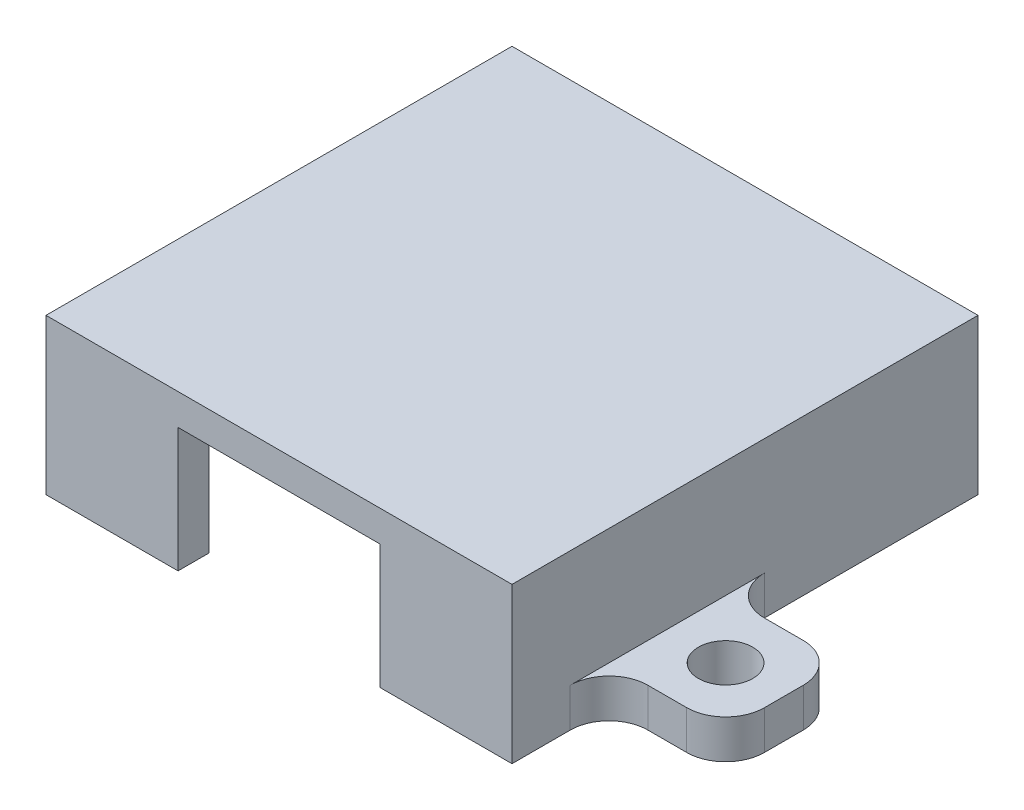
ISO-10303-21;
HEADER;
FILE_DESCRIPTION(('STEP AP214'),'2;1');
FILE_NAME('part.step','',(''),(''),'','','');
FILE_SCHEMA(('AUTOMOTIVE_DESIGN { 1 0 10303 214 1 1 1 1 }'));
ENDSEC;
DATA;
#1=APPLICATION_CONTEXT('core data for automotive mechanical design processes');
#2=APPLICATION_PROTOCOL_DEFINITION('international standard','automotive_design',2000,#1);
#3=PRODUCT_CONTEXT('',#1,'mechanical');
#4=PRODUCT('Part','Part','',(#3));
#5=PRODUCT_RELATED_PRODUCT_CATEGORY('part','',(#4));
#6=PRODUCT_DEFINITION_FORMATION('','',#4);
#7=PRODUCT_DEFINITION_CONTEXT('part definition',#1,'design');
#8=PRODUCT_DEFINITION('design','',#6,#7);
#9=PRODUCT_DEFINITION_SHAPE('','',#8);
#10=(LENGTH_UNIT() NAMED_UNIT(*) SI_UNIT(.MILLI.,.METRE.));
#11=(NAMED_UNIT(*) PLANE_ANGLE_UNIT() SI_UNIT($,.RADIAN.));
#12=(NAMED_UNIT(*) SI_UNIT($,.STERADIAN.) SOLID_ANGLE_UNIT());
#13=UNCERTAINTY_MEASURE_WITH_UNIT(LENGTH_MEASURE(1.E-05),#10,'distance_accuracy_value','');
#14=(GEOMETRIC_REPRESENTATION_CONTEXT(3) GLOBAL_UNCERTAINTY_ASSIGNED_CONTEXT((#13)) GLOBAL_UNIT_ASSIGNED_CONTEXT((#10,
#11,#12)) REPRESENTATION_CONTEXT('',''));
#15=CARTESIAN_POINT('',(0.,0.,0.));
#16=DIRECTION('',(0.,0.,1.));
#17=DIRECTION('',(1.,0.,0.));
#18=AXIS2_PLACEMENT_3D('',#15,#16,#17);
#19=CARTESIAN_POINT('',(0.,10.,0.));
#20=DIRECTION('',(1.,0.,0.));
#21=DIRECTION('',(0.,0.,-1.));
#22=AXIS2_PLACEMENT_3D('',#19,#20,#21);
#23=PLANE('',#22);
#24=DIRECTION('',(0.,0.,-1.));
#25=VECTOR('',#24,1.);
#26=CARTESIAN_POINT('',(0.,2.5,-6.25));
#27=LINE('',#26,#25);
#28=CARTESIAN_POINT('',(0.,2.5,-3.75));
#29=VERTEX_POINT('',#28);
#30=CARTESIAN_POINT('',(0.,2.5,-16.25));
#31=VERTEX_POINT('',#30);
#32=EDGE_CURVE('E493',#29,#31,#27,.T.);
#33=ORIENTED_EDGE('',*,*,#32,.F.);
#34=DIRECTION('',(0.,1.,0.));
#35=VECTOR('',#34,1.);
#36=CARTESIAN_POINT('',(0.,0.,-3.75));
#37=LINE('',#36,#35);
#38=CARTESIAN_POINT('',(0.,0.,-3.75));
#39=VERTEX_POINT('',#38);
#40=EDGE_CURVE('E357',#29,#39,#37,.F.);
#41=ORIENTED_EDGE('',*,*,#40,.T.);
#42=DIRECTION('',(0.,0.,1.));
#43=VECTOR('',#42,1.);
#44=CARTESIAN_POINT('',(0.,0.,0.));
#45=LINE('',#44,#43);
#46=CARTESIAN_POINT('',(0.,0.,0.));
#47=VERTEX_POINT('',#46);
#48=EDGE_CURVE('E311',#39,#47,#45,.T.);
#49=ORIENTED_EDGE('',*,*,#48,.T.);
#50=DIRECTION('',(0.,-1.,0.));
#51=VECTOR('',#50,1.);
#52=CARTESIAN_POINT('',(0.,10.,0.));
#53=LINE('',#52,#51);
#54=CARTESIAN_POINT('',(0.,10.,0.));
#55=VERTEX_POINT('',#54);
#56=EDGE_CURVE('E346',#55,#47,#53,.T.);
#57=ORIENTED_EDGE('',*,*,#56,.F.);
#58=DIRECTION('',(0.,0.,1.));
#59=VECTOR('',#58,1.);
#60=CARTESIAN_POINT('',(0.,10.,0.));
#61=LINE('',#60,#59);
#62=CARTESIAN_POINT('',(0.,10.,-30.));
#63=VERTEX_POINT('',#62);
#64=EDGE_CURVE('E313',#63,#55,#61,.T.);
#65=ORIENTED_EDGE('',*,*,#64,.F.);
#66=DIRECTION('',(0.,-1.,0.));
#67=VECTOR('',#66,1.);
#68=CARTESIAN_POINT('',(0.,10.,-30.));
#69=LINE('',#68,#67);
#70=CARTESIAN_POINT('',(0.,0.,-30.));
#71=VERTEX_POINT('',#70);
#72=EDGE_CURVE('E323',#63,#71,#69,.T.);
#73=ORIENTED_EDGE('',*,*,#72,.T.);
#74=CARTESIAN_POINT('',(0.,0.,-16.25));
#75=VERTEX_POINT('',#74);
#76=EDGE_CURVE('E324',#71,#75,#45,.T.);
#77=ORIENTED_EDGE('',*,*,#76,.T.);
#78=DIRECTION('',(0.,-1.,0.));
#79=VECTOR('',#78,1.);
#80=CARTESIAN_POINT('',(0.,2.5,-16.25));
#81=LINE('',#80,#79);
#82=EDGE_CURVE('E354',#75,#31,#81,.F.);
#83=ORIENTED_EDGE('',*,*,#82,.T.);
#84=EDGE_LOOP('',(#33,#41,#49,#57,#65,#73,#77,#83));
#85=FACE_BOUND('',#84,.T.);
#86=ADVANCED_FACE('F35',(#85),#23,.F.);
#87=CARTESIAN_POINT('',(0.,0.,0.));
#88=DIRECTION('',(0.,-1.,0.));
#89=DIRECTION('',(0.,0.,-1.));
#90=AXIS2_PLACEMENT_3D('',#87,#88,#89);
#91=PLANE('',#90);
#92=CARTESIAN_POINT('',(33.75,0.,-10.));
#93=DIRECTION('',(0.,-1.,0.));
#94=DIRECTION('',(0.,0.,1.));
#95=AXIS2_PLACEMENT_3D('',#92,#93,#94);
#96=CIRCLE('',#95,1.75);
#97=CARTESIAN_POINT('',(33.75,0.,-8.25));
#98=VERTEX_POINT('',#97);
#99=EDGE_CURVE('E646',#98,#98,#96,.T.);
#100=ORIENTED_EDGE('',*,*,#99,.F.);
#101=EDGE_LOOP('',(#100));
#102=FACE_BOUND('',#101,.T.);
#103=DIRECTION('',(-1.,0.,0.));
#104=VECTOR('',#103,1.);
#105=CARTESIAN_POINT('',(37.5,0.,-13.75));
#106=LINE('',#105,#104);
#107=CARTESIAN_POINT('',(35.,0.,-13.75));
#108=VERTEX_POINT('',#107);
#109=CARTESIAN_POINT('',(32.5,0.,-13.75));
#110=VERTEX_POINT('',#109);
#111=EDGE_CURVE('E473',#108,#110,#106,.T.);
#112=ORIENTED_EDGE('',*,*,#111,.F.);
#113=CARTESIAN_POINT('',(35.,0.,-11.25));
#114=DIRECTION('',(0.,-1.,0.));
#115=DIRECTION('',(0.,0.,-1.));
#116=AXIS2_PLACEMENT_3D('',#113,#114,#115);
#117=CIRCLE('',#116,2.5);
#118=CARTESIAN_POINT('',(37.5,0.,-11.25));
#119=VERTEX_POINT('',#118);
#120=EDGE_CURVE('E394',#108,#119,#117,.T.);
#121=ORIENTED_EDGE('',*,*,#120,.T.);
#122=DIRECTION('',(0.,0.,1.));
#123=VECTOR('',#122,1.);
#124=CARTESIAN_POINT('',(37.5,0.,-6.25));
#125=LINE('',#124,#123);
#126=CARTESIAN_POINT('',(37.5,0.,-8.75));
#127=VERTEX_POINT('',#126);
#128=EDGE_CURVE('E641',#119,#127,#125,.T.);
#129=ORIENTED_EDGE('',*,*,#128,.T.);
#130=CARTESIAN_POINT('',(35.,0.,-8.75));
#131=DIRECTION('',(0.,-1.,0.));
#132=DIRECTION('',(0.,0.,-1.));
#133=AXIS2_PLACEMENT_3D('',#130,#131,#132);
#134=CIRCLE('',#133,2.5);
#135=CARTESIAN_POINT('',(35.,0.,-6.25));
#136=VERTEX_POINT('',#135);
#137=EDGE_CURVE('E392',#127,#136,#134,.T.);
#138=ORIENTED_EDGE('',*,*,#137,.T.);
#139=DIRECTION('',(-1.,0.,0.));
#140=VECTOR('',#139,1.);
#141=CARTESIAN_POINT('',(37.5,0.,-6.25));
#142=LINE('',#141,#140);
#143=CARTESIAN_POINT('',(32.5,0.,-6.25));
#144=VERTEX_POINT('',#143);
#145=EDGE_CURVE('E438',#136,#144,#142,.T.);
#146=ORIENTED_EDGE('',*,*,#145,.T.);
#147=CARTESIAN_POINT('',(32.5,0.,-3.75));
#148=DIRECTION('',(0.,-1.,0.));
#149=DIRECTION('',(0.,0.,-1.));
#150=AXIS2_PLACEMENT_3D('',#147,#148,#149);
#151=CIRCLE('',#150,2.5);
#152=CARTESIAN_POINT('',(30.,0.,-3.75));
#153=VERTEX_POINT('',#152);
#154=EDGE_CURVE('E12',#144,#153,#151,.F.);
#155=ORIENTED_EDGE('',*,*,#154,.T.);
#156=DIRECTION('',(0.,0.,-1.));
#157=VECTOR('',#156,1.);
#158=CARTESIAN_POINT('',(30.,0.,0.));
#159=LINE('',#158,#157);
#160=CARTESIAN_POINT('',(30.,0.,0.));
#161=VERTEX_POINT('',#160);
#162=EDGE_CURVE('E332',#161,#153,#159,.T.);
#163=ORIENTED_EDGE('',*,*,#162,.F.);
#164=DIRECTION('',(1.,0.,0.));
#165=VECTOR('',#164,1.);
#166=CARTESIAN_POINT('',(0.,0.,0.));
#167=LINE('',#166,#165);
#168=CARTESIAN_POINT('',(21.5,0.,0.));
#169=VERTEX_POINT('',#168);
#170=EDGE_CURVE('E327',#169,#161,#167,.T.);
#171=ORIENTED_EDGE('',*,*,#170,.F.);
#172=DIRECTION('',(0.,0.,1.));
#173=VECTOR('',#172,1.);
#174=CARTESIAN_POINT('',(21.5,0.,0.));
#175=LINE('',#174,#173);
#176=CARTESIAN_POINT('',(21.5,0.,-2.));
#177=VERTEX_POINT('',#176);
#178=EDGE_CURVE('E285',#177,#169,#175,.T.);
#179=ORIENTED_EDGE('',*,*,#178,.F.);
#180=DIRECTION('',(-1.,0.,0.));
#181=VECTOR('',#180,1.);
#182=CARTESIAN_POINT('',(21.5,0.,-2.));
#183=LINE('',#182,#181);
#184=CARTESIAN_POINT('',(28.,0.,-2.));
#185=VERTEX_POINT('',#184);
#186=EDGE_CURVE('E282',#185,#177,#183,.T.);
#187=ORIENTED_EDGE('',*,*,#186,.F.);
#188=DIRECTION('',(0.,0.,1.));
#189=VECTOR('',#188,1.);
#190=CARTESIAN_POINT('',(28.,0.,-2.));
#191=LINE('',#190,#189);
#192=CARTESIAN_POINT('',(28.,0.,-30.));
#193=VERTEX_POINT('',#192);
#194=EDGE_CURVE('E279',#193,#185,#191,.T.);
#195=ORIENTED_EDGE('',*,*,#194,.F.);
#196=DIRECTION('',(-1.,0.,0.));
#197=VECTOR('',#196,1.);
#198=CARTESIAN_POINT('',(0.,0.,-30.));
#199=LINE('',#198,#197);
#200=CARTESIAN_POINT('',(30.,0.,-30.));
#201=VERTEX_POINT('',#200);
#202=EDGE_CURVE('E317',#201,#193,#199,.T.);
#203=ORIENTED_EDGE('',*,*,#202,.F.);
#204=CARTESIAN_POINT('',(30.,0.,-16.25));
#205=VERTEX_POINT('',#204);
#206=EDGE_CURVE('E331',#205,#201,#159,.T.);
#207=ORIENTED_EDGE('',*,*,#206,.F.);
#208=CARTESIAN_POINT('',(32.5,0.,-16.25));
#209=DIRECTION('',(0.,-1.,0.));
#210=DIRECTION('',(0.,0.,-1.));
#211=AXIS2_PLACEMENT_3D('',#208,#209,#210);
#212=CIRCLE('',#211,2.5);
#213=EDGE_CURVE('E413',#205,#110,#212,.F.);
#214=ORIENTED_EDGE('',*,*,#213,.T.);
#215=EDGE_LOOP('',(#112,#121,#129,#138,#146,#155,#163,#171,#179,#187,#195,#203,#207,#214));
#216=FACE_BOUND('',#215,.T.);
#217=ADVANCED_FACE('F436',(#102,#216),#91,.T.);
#218=DIRECTION('',(0.,0.,-1.));
#219=VECTOR('',#218,1.);
#220=CARTESIAN_POINT('',(22.,0.,-28.));
#221=LINE('',#220,#219);
#222=CARTESIAN_POINT('',(22.,0.,-28.));
#223=VERTEX_POINT('',#222);
#224=CARTESIAN_POINT('',(22.,0.,-30.));
#225=VERTEX_POINT('',#224);
#226=EDGE_CURVE('E277',#223,#225,#221,.T.);
#227=ORIENTED_EDGE('',*,*,#226,.F.);
#228=DIRECTION('',(1.,0.,0.));
#229=VECTOR('',#228,1.);
#230=CARTESIAN_POINT('',(8.,0.,-28.));
#231=LINE('',#230,#229);
#232=CARTESIAN_POINT('',(8.,0.,-28.));
#233=VERTEX_POINT('',#232);
#234=EDGE_CURVE('E271',#233,#223,#231,.T.);
#235=ORIENTED_EDGE('',*,*,#234,.F.);
#236=DIRECTION('',(0.,0.,1.));
#237=VECTOR('',#236,1.);
#238=CARTESIAN_POINT('',(8.,0.,-30.));
#239=LINE('',#238,#237);
#240=CARTESIAN_POINT('',(8.,0.,-30.));
#241=VERTEX_POINT('',#240);
#242=EDGE_CURVE('E268',#241,#233,#239,.T.);
#243=ORIENTED_EDGE('',*,*,#242,.F.);
#244=EDGE_CURVE('E337',#225,#241,#199,.T.);
#245=ORIENTED_EDGE('',*,*,#244,.F.);
#246=EDGE_LOOP('',(#227,#235,#243,#245));
#247=FACE_BOUND('',#246,.T.);
#248=ADVANCED_FACE('F580',(#247),#91,.T.);
#249=CARTESIAN_POINT('',(0.,10.,0.));
#250=DIRECTION('',(0.,0.,-1.));
#251=DIRECTION('',(-1.,0.,0.));
#252=AXIS2_PLACEMENT_3D('',#249,#250,#251);
#253=PLANE('',#252);
#254=CARTESIAN_POINT('',(8.5,0.,0.));
#255=VERTEX_POINT('',#254);
#256=EDGE_CURVE('E328',#47,#255,#167,.T.);
#257=ORIENTED_EDGE('',*,*,#256,.T.);
#258=DIRECTION('',(0.,-1.,0.));
#259=VECTOR('',#258,1.);
#260=CARTESIAN_POINT('',(8.5,49.6988664825584,0.));
#261=LINE('',#260,#259);
#262=CARTESIAN_POINT('',(8.5,8.,0.));
#263=VERTEX_POINT('',#262);
#264=EDGE_CURVE('E287',#263,#255,#261,.T.);
#265=ORIENTED_EDGE('',*,*,#264,.F.);
#266=DIRECTION('',(1.,0.,0.));
#267=VECTOR('',#266,1.);
#268=CARTESIAN_POINT('',(8.5,8.,0.));
#269=LINE('',#268,#267);
#270=CARTESIAN_POINT('',(21.5,8.,0.));
#271=VERTEX_POINT('',#270);
#272=EDGE_CURVE('E531',#263,#271,#269,.T.);
#273=ORIENTED_EDGE('',*,*,#272,.T.);
#274=DIRECTION('',(0.,-1.,0.));
#275=VECTOR('',#274,1.);
#276=CARTESIAN_POINT('',(21.5,49.6988664825584,0.));
#277=LINE('',#276,#275);
#278=EDGE_CURVE('E289',#271,#169,#277,.T.);
#279=ORIENTED_EDGE('',*,*,#278,.T.);
#280=ORIENTED_EDGE('',*,*,#170,.T.);
#281=DIRECTION('',(0.,-1.,0.));
#282=VECTOR('',#281,1.);
#283=CARTESIAN_POINT('',(30.,10.,0.));
#284=LINE('',#283,#282);
#285=CARTESIAN_POINT('',(30.,10.,0.));
#286=VERTEX_POINT('',#285);
#287=EDGE_CURVE('E343',#286,#161,#284,.T.);
#288=ORIENTED_EDGE('',*,*,#287,.F.);
#289=DIRECTION('',(1.,0.,0.));
#290=VECTOR('',#289,1.);
#291=CARTESIAN_POINT('',(0.,10.,0.));
#292=LINE('',#291,#290);
#293=EDGE_CURVE('E316',#55,#286,#292,.T.);
#294=ORIENTED_EDGE('',*,*,#293,.F.);
#295=ORIENTED_EDGE('',*,*,#56,.T.);
#296=EDGE_LOOP('',(#257,#265,#273,#279,#280,#288,#294,#295));
#297=FACE_BOUND('',#296,.T.);
#298=ADVANCED_FACE('F444',(#297),#253,.F.);
#299=CARTESIAN_POINT('',(30.,10.,0.));
#300=DIRECTION('',(-1.,0.,0.));
#301=DIRECTION('',(0.,0.,1.));
#302=AXIS2_PLACEMENT_3D('',#299,#300,#301);
#303=PLANE('',#302);
#304=DIRECTION('',(0.,0.,-1.));
#305=VECTOR('',#304,1.);
#306=CARTESIAN_POINT('',(30.,2.5,-6.25));
#307=LINE('',#306,#305);
#308=CARTESIAN_POINT('',(30.,2.5,-3.75));
#309=VERTEX_POINT('',#308);
#310=CARTESIAN_POINT('',(30.,2.5,-16.25));
#311=VERTEX_POINT('',#310);
#312=EDGE_CURVE('E50',#309,#311,#307,.T.);
#313=ORIENTED_EDGE('',*,*,#312,.T.);
#314=DIRECTION('',(0.,-1.,0.));
#315=VECTOR('',#314,1.);
#316=CARTESIAN_POINT('',(30.,10.,-16.25));
#317=LINE('',#316,#315);
#318=EDGE_CURVE('E406',#311,#205,#317,.T.);
#319=ORIENTED_EDGE('',*,*,#318,.T.);
#320=ORIENTED_EDGE('',*,*,#206,.T.);
#321=DIRECTION('',(0.,-1.,0.));
#322=VECTOR('',#321,1.);
#323=CARTESIAN_POINT('',(30.,10.,-30.));
#324=LINE('',#323,#322);
#325=CARTESIAN_POINT('',(30.,10.,-30.));
#326=VERTEX_POINT('',#325);
#327=EDGE_CURVE('E340',#326,#201,#324,.T.);
#328=ORIENTED_EDGE('',*,*,#327,.F.);
#329=DIRECTION('',(0.,0.,-1.));
#330=VECTOR('',#329,1.);
#331=CARTESIAN_POINT('',(30.,10.,0.));
#332=LINE('',#331,#330);
#333=EDGE_CURVE('E319',#286,#326,#332,.T.);
#334=ORIENTED_EDGE('',*,*,#333,.F.);
#335=ORIENTED_EDGE('',*,*,#287,.T.);
#336=ORIENTED_EDGE('',*,*,#162,.T.);
#337=DIRECTION('',(0.,1.,0.));
#338=VECTOR('',#337,1.);
#339=CARTESIAN_POINT('',(30.,10.,-3.75));
#340=LINE('',#339,#338);
#341=EDGE_CURVE('E404',#153,#309,#340,.T.);
#342=ORIENTED_EDGE('',*,*,#341,.T.);
#343=EDGE_LOOP('',(#313,#319,#320,#328,#334,#335,#336,#342));
#344=FACE_BOUND('',#343,.T.);
#345=ADVANCED_FACE('F439',(#344),#303,.F.);
#346=CARTESIAN_POINT('',(0.,10.,-30.));
#347=DIRECTION('',(0.,0.,1.));
#348=DIRECTION('',(1.,0.,0.));
#349=AXIS2_PLACEMENT_3D('',#346,#347,#348);
#350=PLANE('',#349);
#351=ORIENTED_EDGE('',*,*,#244,.T.);
#352=DIRECTION('',(0.,-1.,0.));
#353=VECTOR('',#352,1.);
#354=CARTESIAN_POINT('',(8.,49.6988664825584,-30.));
#355=LINE('',#354,#353);
#356=CARTESIAN_POINT('',(8.,8.,-30.));
#357=VERTEX_POINT('',#356);
#358=EDGE_CURVE('E305',#357,#241,#355,.T.);
#359=ORIENTED_EDGE('',*,*,#358,.F.);
#360=DIRECTION('',(-1.,0.,0.));
#361=VECTOR('',#360,1.);
#362=CARTESIAN_POINT('',(2.,8.,-30.));
#363=LINE('',#362,#361);
#364=CARTESIAN_POINT('',(2.,8.,-30.));
#365=VERTEX_POINT('',#364);
#366=EDGE_CURVE('E516',#357,#365,#363,.T.);
#367=ORIENTED_EDGE('',*,*,#366,.T.);
#368=DIRECTION('',(0.,-1.,0.));
#369=VECTOR('',#368,1.);
#370=CARTESIAN_POINT('',(2.,49.6988664825584,-30.));
#371=LINE('',#370,#369);
#372=CARTESIAN_POINT('',(2.,0.,-30.));
#373=VERTEX_POINT('',#372);
#374=EDGE_CURVE('E251',#365,#373,#371,.T.);
#375=ORIENTED_EDGE('',*,*,#374,.T.);
#376=EDGE_CURVE('E267',#373,#71,#199,.T.);
#377=ORIENTED_EDGE('',*,*,#376,.T.);
#378=ORIENTED_EDGE('',*,*,#72,.F.);
#379=DIRECTION('',(-1.,0.,0.));
#380=VECTOR('',#379,1.);
#381=CARTESIAN_POINT('',(0.,10.,-30.));
#382=LINE('',#381,#380);
#383=EDGE_CURVE('E321',#326,#63,#382,.T.);
#384=ORIENTED_EDGE('',*,*,#383,.F.);
#385=ORIENTED_EDGE('',*,*,#327,.T.);
#386=ORIENTED_EDGE('',*,*,#202,.T.);
#387=DIRECTION('',(0.,-1.,0.));
#388=VECTOR('',#387,1.);
#389=CARTESIAN_POINT('',(28.,49.6988664825584,-30.));
#390=LINE('',#389,#388);
#391=CARTESIAN_POINT('',(28.,8.,-30.));
#392=VERTEX_POINT('',#391);
#393=EDGE_CURVE('E296',#392,#193,#390,.T.);
#394=ORIENTED_EDGE('',*,*,#393,.F.);
#395=DIRECTION('',(-1.,0.,0.));
#396=VECTOR('',#395,1.);
#397=CARTESIAN_POINT('',(22.,8.,-30.));
#398=LINE('',#397,#396);
#399=CARTESIAN_POINT('',(22.,8.,-30.));
#400=VERTEX_POINT('',#399);
#401=EDGE_CURVE('E525',#392,#400,#398,.T.);
#402=ORIENTED_EDGE('',*,*,#401,.T.);
#403=DIRECTION('',(0.,-1.,0.));
#404=VECTOR('',#403,1.);
#405=CARTESIAN_POINT('',(22.,49.6988664825584,-30.));
#406=LINE('',#405,#404);
#407=EDGE_CURVE('E298',#400,#225,#406,.T.);
#408=ORIENTED_EDGE('',*,*,#407,.T.);
#409=EDGE_LOOP('',(#351,#359,#367,#375,#377,#378,#384,#385,#386,#394,#402,#408));
#410=FACE_BOUND('',#409,.T.);
#411=ADVANCED_FACE('F467',(#410),#350,.F.);
#412=CARTESIAN_POINT('',(0.,10.,0.));
#413=DIRECTION('',(0.,-1.,0.));
#414=DIRECTION('',(0.,0.,-1.));
#415=AXIS2_PLACEMENT_3D('',#412,#413,#414);
#416=PLANE('',#415);
#417=ORIENTED_EDGE('',*,*,#64,.T.);
#418=ORIENTED_EDGE('',*,*,#293,.T.);
#419=ORIENTED_EDGE('',*,*,#333,.T.);
#420=ORIENTED_EDGE('',*,*,#383,.T.);
#421=EDGE_LOOP('',(#417,#418,#419,#420));
#422=FACE_BOUND('',#421,.T.);
#423=ADVANCED_FACE('F752',(#422),#416,.F.);
#424=CARTESIAN_POINT('',(-3.75,0.,-10.));
#425=DIRECTION('',(0.,1.,0.));
#426=DIRECTION('',(0.,0.,1.));
#427=AXIS2_PLACEMENT_3D('',#424,#425,#426);
#428=CIRCLE('',#427,1.75);
#429=CARTESIAN_POINT('',(-3.75,0.,-8.25));
#430=VERTEX_POINT('',#429);
#431=EDGE_CURVE('E490',#430,#430,#428,.T.);
#432=ORIENTED_EDGE('',*,*,#431,.T.);
#433=EDGE_LOOP('',(#432));
#434=FACE_BOUND('',#433,.T.);
#435=DIRECTION('',(1.,0.,0.));
#436=VECTOR('',#435,1.);
#437=CARTESIAN_POINT('',(-7.5,0.,-6.25));
#438=LINE('',#437,#436);
#439=CARTESIAN_POINT('',(-5.,0.,-6.25));
#440=VERTEX_POINT('',#439);
#441=CARTESIAN_POINT('',(-2.5,0.,-6.25));
#442=VERTEX_POINT('',#441);
#443=EDGE_CURVE('E502',#440,#442,#438,.T.);
#444=ORIENTED_EDGE('',*,*,#443,.F.);
#445=CARTESIAN_POINT('',(-5.,0.,-8.75));
#446=DIRECTION('',(0.,-1.,0.));
#447=DIRECTION('',(0.,0.,-1.));
#448=AXIS2_PLACEMENT_3D('',#445,#446,#447);
#449=CIRCLE('',#448,2.5);
#450=CARTESIAN_POINT('',(-7.5,0.,-8.75));
#451=VERTEX_POINT('',#450);
#452=EDGE_CURVE('E371',#440,#451,#449,.T.);
#453=ORIENTED_EDGE('',*,*,#452,.T.);
#454=DIRECTION('',(0.,0.,1.));
#455=VECTOR('',#454,1.);
#456=CARTESIAN_POINT('',(-7.5,0.,-6.25));
#457=LINE('',#456,#455);
#458=CARTESIAN_POINT('',(-7.5,0.,-11.25));
#459=VERTEX_POINT('',#458);
#460=EDGE_CURVE('E499',#459,#451,#457,.T.);
#461=ORIENTED_EDGE('',*,*,#460,.F.);
#462=CARTESIAN_POINT('',(-5.,0.,-11.25));
#463=DIRECTION('',(0.,-1.,0.));
#464=DIRECTION('',(0.,0.,-1.));
#465=AXIS2_PLACEMENT_3D('',#462,#463,#464);
#466=CIRCLE('',#465,2.5);
#467=CARTESIAN_POINT('',(-5.,0.,-13.75));
#468=VERTEX_POINT('',#467);
#469=EDGE_CURVE('E369',#459,#468,#466,.T.);
#470=ORIENTED_EDGE('',*,*,#469,.T.);
#471=DIRECTION('',(1.,0.,0.));
#472=VECTOR('',#471,1.);
#473=CARTESIAN_POINT('',(-7.5,0.,-13.75));
#474=LINE('',#473,#472);
#475=CARTESIAN_POINT('',(-2.5,0.,-13.75));
#476=VERTEX_POINT('',#475);
#477=EDGE_CURVE('E506',#468,#476,#474,.T.);
#478=ORIENTED_EDGE('',*,*,#477,.T.);
#479=CARTESIAN_POINT('',(-2.5,0.,-16.25));
#480=DIRECTION('',(0.,-1.,0.));
#481=DIRECTION('',(0.,0.,-1.));
#482=AXIS2_PLACEMENT_3D('',#479,#480,#481);
#483=CIRCLE('',#482,2.5);
#484=EDGE_CURVE('E383',#476,#75,#483,.F.);
#485=ORIENTED_EDGE('',*,*,#484,.T.);
#486=ORIENTED_EDGE('',*,*,#76,.F.);
#487=ORIENTED_EDGE('',*,*,#376,.F.);
#488=DIRECTION('',(0.,0.,-1.));
#489=VECTOR('',#488,1.);
#490=CARTESIAN_POINT('',(2.,0.,-28.));
#491=LINE('',#490,#489);
#492=CARTESIAN_POINT('',(2.,0.,-2.));
#493=VERTEX_POINT('',#492);
#494=EDGE_CURVE('E246',#493,#373,#491,.T.);
#495=ORIENTED_EDGE('',*,*,#494,.F.);
#496=DIRECTION('',(-1.,0.,0.));
#497=VECTOR('',#496,1.);
#498=CARTESIAN_POINT('',(2.,0.,-2.));
#499=LINE('',#498,#497);
#500=CARTESIAN_POINT('',(8.5,0.,-2.));
#501=VERTEX_POINT('',#500);
#502=EDGE_CURVE('E256',#501,#493,#499,.T.);
#503=ORIENTED_EDGE('',*,*,#502,.F.);
#504=DIRECTION('',(0.,0.,-1.));
#505=VECTOR('',#504,1.);
#506=CARTESIAN_POINT('',(8.5,0.,-2.));
#507=LINE('',#506,#505);
#508=EDGE_CURVE('E261',#255,#501,#507,.T.);
#509=ORIENTED_EDGE('',*,*,#508,.F.);
#510=ORIENTED_EDGE('',*,*,#256,.F.);
#511=ORIENTED_EDGE('',*,*,#48,.F.);
#512=CARTESIAN_POINT('',(-2.5,0.,-3.75));
#513=DIRECTION('',(0.,-1.,0.));
#514=DIRECTION('',(0.,0.,-1.));
#515=AXIS2_PLACEMENT_3D('',#512,#513,#514);
#516=CIRCLE('',#515,2.5);
#517=EDGE_CURVE('E381',#39,#442,#516,.F.);
#518=ORIENTED_EDGE('',*,*,#517,.T.);
#519=EDGE_LOOP('',(#444,#453,#461,#470,#478,#485,#486,#487,#495,#503,#509,#510,#511,#518));
#520=FACE_BOUND('',#519,.T.);
#521=ADVANCED_FACE('F265',(#434,#520),#91,.T.);
#522=CARTESIAN_POINT('',(8.5,49.6988664825584,-2.));
#523=DIRECTION('',(-1.,0.,0.));
#524=DIRECTION('',(0.,0.,1.));
#525=AXIS2_PLACEMENT_3D('',#522,#523,#524);
#526=PLANE('',#525);
#527=DIRECTION('',(0.,0.,1.));
#528=VECTOR('',#527,1.);
#529=CARTESIAN_POINT('',(8.5,8.,-2.));
#530=LINE('',#529,#528);
#531=CARTESIAN_POINT('',(8.5,8.,-2.));
#532=VERTEX_POINT('',#531);
#533=EDGE_CURVE('E312',#532,#263,#530,.T.);
#534=ORIENTED_EDGE('',*,*,#533,.T.);
#535=ORIENTED_EDGE('',*,*,#264,.T.);
#536=ORIENTED_EDGE('',*,*,#508,.T.);
#537=DIRECTION('',(0.,-1.,0.));
#538=VECTOR('',#537,1.);
#539=CARTESIAN_POINT('',(8.5,49.6988664825584,-2.));
#540=LINE('',#539,#538);
#541=EDGE_CURVE('E252',#532,#501,#540,.T.);
#542=ORIENTED_EDGE('',*,*,#541,.F.);
#543=EDGE_LOOP('',(#534,#535,#536,#542));
#544=FACE_BOUND('',#543,.T.);
#545=ADVANCED_FACE('F534',(#544),#526,.F.);
#546=CARTESIAN_POINT('',(21.5,49.6988664825584,0.));
#547=DIRECTION('',(1.,0.,0.));
#548=DIRECTION('',(0.,0.,-1.));
#549=AXIS2_PLACEMENT_3D('',#546,#547,#548);
#550=PLANE('',#549);
#551=DIRECTION('',(0.,0.,-1.));
#552=VECTOR('',#551,1.);
#553=CARTESIAN_POINT('',(21.5,8.,0.));
#554=LINE('',#553,#552);
#555=CARTESIAN_POINT('',(21.5,8.,-2.));
#556=VERTEX_POINT('',#555);
#557=EDGE_CURVE('E453',#271,#556,#554,.T.);
#558=ORIENTED_EDGE('',*,*,#557,.T.);
#559=DIRECTION('',(0.,-1.,0.));
#560=VECTOR('',#559,1.);
#561=CARTESIAN_POINT('',(21.5,49.6988664825584,-2.));
#562=LINE('',#561,#560);
#563=EDGE_CURVE('E292',#556,#177,#562,.T.);
#564=ORIENTED_EDGE('',*,*,#563,.T.);
#565=ORIENTED_EDGE('',*,*,#178,.T.);
#566=ORIENTED_EDGE('',*,*,#278,.F.);
#567=EDGE_LOOP('',(#558,#564,#565,#566));
#568=FACE_BOUND('',#567,.T.);
#569=ADVANCED_FACE('F451',(#568),#550,.F.);
#570=CARTESIAN_POINT('',(21.5,49.6988664825584,-2.));
#571=DIRECTION('',(0.,0.,1.));
#572=DIRECTION('',(1.,0.,0.));
#573=AXIS2_PLACEMENT_3D('',#570,#571,#572);
#574=PLANE('',#573);
#575=DIRECTION('',(1.,0.,0.));
#576=VECTOR('',#575,1.);
#577=CARTESIAN_POINT('',(21.5,8.,-2.));
#578=LINE('',#577,#576);
#579=CARTESIAN_POINT('',(28.,8.,-2.));
#580=VERTEX_POINT('',#579);
#581=EDGE_CURVE('E458',#556,#580,#578,.T.);
#582=ORIENTED_EDGE('',*,*,#581,.T.);
#583=DIRECTION('',(0.,-1.,0.));
#584=VECTOR('',#583,1.);
#585=CARTESIAN_POINT('',(28.,49.6988664825584,-2.));
#586=LINE('',#585,#584);
#587=EDGE_CURVE('E294',#580,#185,#586,.T.);
#588=ORIENTED_EDGE('',*,*,#587,.T.);
#589=ORIENTED_EDGE('',*,*,#186,.T.);
#590=ORIENTED_EDGE('',*,*,#563,.F.);
#591=EDGE_LOOP('',(#582,#588,#589,#590));
#592=FACE_BOUND('',#591,.T.);
#593=ADVANCED_FACE('F456',(#592),#574,.F.);
#594=CARTESIAN_POINT('',(28.,49.6988664825584,-2.));
#595=DIRECTION('',(1.,0.,0.));
#596=DIRECTION('',(0.,0.,-1.));
#597=AXIS2_PLACEMENT_3D('',#594,#595,#596);
#598=PLANE('',#597);
#599=DIRECTION('',(0.,0.,-1.));
#600=VECTOR('',#599,1.);
#601=CARTESIAN_POINT('',(28.,8.,-2.));
#602=LINE('',#601,#600);
#603=EDGE_CURVE('E527',#580,#392,#602,.T.);
#604=ORIENTED_EDGE('',*,*,#603,.T.);
#605=ORIENTED_EDGE('',*,*,#393,.T.);
#606=ORIENTED_EDGE('',*,*,#194,.T.);
#607=ORIENTED_EDGE('',*,*,#587,.F.);
#608=EDGE_LOOP('',(#604,#605,#606,#607));
#609=FACE_BOUND('',#608,.T.);
#610=ADVANCED_FACE('F461',(#609),#598,.F.);
#611=CARTESIAN_POINT('',(22.,49.6988664825584,-28.));
#612=DIRECTION('',(-1.,0.,0.));
#613=DIRECTION('',(0.,0.,1.));
#614=AXIS2_PLACEMENT_3D('',#611,#612,#613);
#615=PLANE('',#614);
#616=DIRECTION('',(0.,0.,1.));
#617=VECTOR('',#616,1.);
#618=CARTESIAN_POINT('',(22.,8.,-28.));
#619=LINE('',#618,#617);
#620=CARTESIAN_POINT('',(22.,8.,-28.));
#621=VERTEX_POINT('',#620);
#622=EDGE_CURVE('E523',#400,#621,#619,.T.);
#623=ORIENTED_EDGE('',*,*,#622,.T.);
#624=DIRECTION('',(0.,-1.,0.));
#625=VECTOR('',#624,1.);
#626=CARTESIAN_POINT('',(22.,49.6988664825584,-28.));
#627=LINE('',#626,#625);
#628=EDGE_CURVE('E301',#621,#223,#627,.T.);
#629=ORIENTED_EDGE('',*,*,#628,.T.);
#630=ORIENTED_EDGE('',*,*,#226,.T.);
#631=ORIENTED_EDGE('',*,*,#407,.F.);
#632=EDGE_LOOP('',(#623,#629,#630,#631));
#633=FACE_BOUND('',#632,.T.);
#634=ADVANCED_FACE('F595',(#633),#615,.F.);
#635=CARTESIAN_POINT('',(8.,49.6988664825584,-28.));
#636=DIRECTION('',(0.,0.,-1.));
#637=DIRECTION('',(-1.,0.,0.));
#638=AXIS2_PLACEMENT_3D('',#635,#636,#637);
#639=PLANE('',#638);
#640=DIRECTION('',(-1.,0.,0.));
#641=VECTOR('',#640,1.);
#642=CARTESIAN_POINT('',(8.,8.,-28.));
#643=LINE('',#642,#641);
#644=CARTESIAN_POINT('',(8.,8.,-28.));
#645=VERTEX_POINT('',#644);
#646=EDGE_CURVE('E521',#621,#645,#643,.T.);
#647=ORIENTED_EDGE('',*,*,#646,.T.);
#648=DIRECTION('',(0.,-1.,0.));
#649=VECTOR('',#648,1.);
#650=CARTESIAN_POINT('',(8.,49.6988664825584,-28.));
#651=LINE('',#650,#649);
#652=EDGE_CURVE('E303',#645,#233,#651,.T.);
#653=ORIENTED_EDGE('',*,*,#652,.T.);
#654=ORIENTED_EDGE('',*,*,#234,.T.);
#655=ORIENTED_EDGE('',*,*,#628,.F.);
#656=EDGE_LOOP('',(#647,#653,#654,#655));
#657=FACE_BOUND('',#656,.T.);
#658=ADVANCED_FACE('F597',(#657),#639,.F.);
#659=CARTESIAN_POINT('',(8.,49.6988664825584,-30.));
#660=DIRECTION('',(1.,0.,0.));
#661=DIRECTION('',(0.,0.,-1.));
#662=AXIS2_PLACEMENT_3D('',#659,#660,#661);
#663=PLANE('',#662);
#664=DIRECTION('',(0.,0.,-1.));
#665=VECTOR('',#664,1.);
#666=CARTESIAN_POINT('',(8.,8.,-30.));
#667=LINE('',#666,#665);
#668=EDGE_CURVE('E519',#645,#357,#667,.T.);
#669=ORIENTED_EDGE('',*,*,#668,.T.);
#670=ORIENTED_EDGE('',*,*,#358,.T.);
#671=ORIENTED_EDGE('',*,*,#242,.T.);
#672=ORIENTED_EDGE('',*,*,#652,.F.);
#673=EDGE_LOOP('',(#669,#670,#671,#672));
#674=FACE_BOUND('',#673,.T.);
#675=ADVANCED_FACE('F584',(#674),#663,.F.);
#676=CARTESIAN_POINT('',(2.,49.6988664825584,-28.));
#677=DIRECTION('',(-1.,0.,0.));
#678=DIRECTION('',(0.,0.,1.));
#679=AXIS2_PLACEMENT_3D('',#676,#677,#678);
#680=PLANE('',#679);
#681=DIRECTION('',(0.,0.,1.));
#682=VECTOR('',#681,1.);
#683=CARTESIAN_POINT('',(2.,8.,-28.));
#684=LINE('',#683,#682);
#685=CARTESIAN_POINT('',(2.,8.,-2.));
#686=VERTEX_POINT('',#685);
#687=EDGE_CURVE('E248',#365,#686,#684,.T.);
#688=ORIENTED_EDGE('',*,*,#687,.T.);
#689=DIRECTION('',(0.,-1.,0.));
#690=VECTOR('',#689,1.);
#691=CARTESIAN_POINT('',(2.,49.6988664825584,-2.));
#692=LINE('',#691,#690);
#693=EDGE_CURVE('E241',#686,#493,#692,.T.);
#694=ORIENTED_EDGE('',*,*,#693,.T.);
#695=ORIENTED_EDGE('',*,*,#494,.T.);
#696=ORIENTED_EDGE('',*,*,#374,.F.);
#697=EDGE_LOOP('',(#688,#694,#695,#696));
#698=FACE_BOUND('',#697,.T.);
#699=ADVANCED_FACE('F243',(#698),#680,.F.);
#700=CARTESIAN_POINT('',(2.,49.6988664825584,-2.));
#701=DIRECTION('',(0.,0.,1.));
#702=DIRECTION('',(1.,0.,0.));
#703=AXIS2_PLACEMENT_3D('',#700,#701,#702);
#704=PLANE('',#703);
#705=DIRECTION('',(1.,0.,0.));
#706=VECTOR('',#705,1.);
#707=CARTESIAN_POINT('',(2.,8.,-2.));
#708=LINE('',#707,#706);
#709=EDGE_CURVE('E309',#686,#532,#708,.T.);
#710=ORIENTED_EDGE('',*,*,#709,.T.);
#711=ORIENTED_EDGE('',*,*,#541,.T.);
#712=ORIENTED_EDGE('',*,*,#502,.T.);
#713=ORIENTED_EDGE('',*,*,#693,.F.);
#714=EDGE_LOOP('',(#710,#711,#712,#713));
#715=FACE_BOUND('',#714,.T.);
#716=ADVANCED_FACE('F257',(#715),#704,.F.);
#717=CARTESIAN_POINT('',(0.,8.,0.));
#718=DIRECTION('',(0.,-1.,0.));
#719=DIRECTION('',(0.,0.,-1.));
#720=AXIS2_PLACEMENT_3D('',#717,#718,#719);
#721=PLANE('',#720);
#722=ORIENTED_EDGE('',*,*,#533,.F.);
#723=ORIENTED_EDGE('',*,*,#709,.F.);
#724=ORIENTED_EDGE('',*,*,#687,.F.);
#725=ORIENTED_EDGE('',*,*,#366,.F.);
#726=ORIENTED_EDGE('',*,*,#668,.F.);
#727=ORIENTED_EDGE('',*,*,#646,.F.);
#728=ORIENTED_EDGE('',*,*,#622,.F.);
#729=ORIENTED_EDGE('',*,*,#401,.F.);
#730=ORIENTED_EDGE('',*,*,#603,.F.);
#731=ORIENTED_EDGE('',*,*,#581,.F.);
#732=ORIENTED_EDGE('',*,*,#557,.F.);
#733=ORIENTED_EDGE('',*,*,#272,.F.);
#734=EDGE_LOOP('',(#722,#723,#724,#725,#726,#727,#728,#729,#730,#731,#732,#733));
#735=FACE_BOUND('',#734,.T.);
#736=ADVANCED_FACE('F590',(#735),#721,.T.);
#737=CARTESIAN_POINT('',(-7.5,0.,-6.25));
#738=DIRECTION('',(0.,0.,-1.));
#739=DIRECTION('',(0.,1.,0.));
#740=AXIS2_PLACEMENT_3D('',#737,#738,#739);
#741=PLANE('',#740);
#742=ORIENTED_EDGE('',*,*,#443,.T.);
#743=DIRECTION('',(0.,1.,0.));
#744=VECTOR('',#743,1.);
#745=CARTESIAN_POINT('',(-2.5,2.5,-6.25));
#746=LINE('',#745,#744);
#747=CARTESIAN_POINT('',(-2.5,2.5,-6.25));
#748=VERTEX_POINT('',#747);
#749=EDGE_CURVE('E351',#442,#748,#746,.T.);
#750=ORIENTED_EDGE('',*,*,#749,.T.);
#751=DIRECTION('',(1.,0.,0.));
#752=VECTOR('',#751,1.);
#753=CARTESIAN_POINT('',(-7.5,2.5,-6.25));
#754=LINE('',#753,#752);
#755=CARTESIAN_POINT('',(-5.,2.5,-6.25));
#756=VERTEX_POINT('',#755);
#757=EDGE_CURVE('E512',#756,#748,#754,.T.);
#758=ORIENTED_EDGE('',*,*,#757,.F.);
#759=DIRECTION('',(0.,1.,0.));
#760=VECTOR('',#759,1.);
#761=CARTESIAN_POINT('',(-5.,0.,-6.25));
#762=LINE('',#761,#760);
#763=EDGE_CURVE('E349',#756,#440,#762,.F.);
#764=ORIENTED_EDGE('',*,*,#763,.T.);
#765=EDGE_LOOP('',(#742,#750,#758,#764));
#766=FACE_BOUND('',#765,.T.);
#767=ADVANCED_FACE('F548',(#766),#741,.F.);
#768=CARTESIAN_POINT('',(-7.5,2.5,-6.25));
#769=DIRECTION('',(0.,-1.,0.));
#770=DIRECTION('',(0.,0.,-1.));
#771=AXIS2_PLACEMENT_3D('',#768,#769,#770);
#772=PLANE('',#771);
#773=CARTESIAN_POINT('',(-3.75,2.5,-10.));
#774=DIRECTION('',(0.,1.,0.));
#775=DIRECTION('',(0.,0.,1.));
#776=AXIS2_PLACEMENT_3D('',#773,#774,#775);
#777=CIRCLE('',#776,1.75);
#778=CARTESIAN_POINT('',(-3.75,2.5,-8.25));
#779=VERTEX_POINT('',#778);
#780=EDGE_CURVE('E489',#779,#779,#777,.T.);
#781=ORIENTED_EDGE('',*,*,#780,.F.);
#782=EDGE_LOOP('',(#781));
#783=FACE_BOUND('',#782,.T.);
#784=DIRECTION('',(0.,0.,-1.));
#785=VECTOR('',#784,1.);
#786=CARTESIAN_POINT('',(-7.5,2.5,-6.25));
#787=LINE('',#786,#785);
#788=CARTESIAN_POINT('',(-7.5,2.5,-8.75));
#789=VERTEX_POINT('',#788);
#790=CARTESIAN_POINT('',(-7.5,2.5,-11.25));
#791=VERTEX_POINT('',#790);
#792=EDGE_CURVE('E496',#789,#791,#787,.T.);
#793=ORIENTED_EDGE('',*,*,#792,.F.);
#794=CARTESIAN_POINT('',(-5.,2.5,-8.75));
#795=DIRECTION('',(0.,-1.,0.));
#796=DIRECTION('',(0.,0.,-1.));
#797=AXIS2_PLACEMENT_3D('',#794,#795,#796);
#798=CIRCLE('',#797,2.5);
#799=EDGE_CURVE('E367',#789,#756,#798,.F.);
#800=ORIENTED_EDGE('',*,*,#799,.T.);
#801=ORIENTED_EDGE('',*,*,#757,.T.);
#802=CARTESIAN_POINT('',(-2.5,2.5,-3.75));
#803=DIRECTION('',(0.,-1.,0.));
#804=DIRECTION('',(0.,0.,-1.));
#805=AXIS2_PLACEMENT_3D('',#802,#803,#804);
#806=CIRCLE('',#805,2.5);
#807=EDGE_CURVE('E378',#748,#29,#806,.T.);
#808=ORIENTED_EDGE('',*,*,#807,.T.);
#809=ORIENTED_EDGE('',*,*,#32,.T.);
#810=CARTESIAN_POINT('',(-2.5,2.5,-16.25));
#811=DIRECTION('',(0.,-1.,0.));
#812=DIRECTION('',(0.,0.,-1.));
#813=AXIS2_PLACEMENT_3D('',#810,#811,#812);
#814=CIRCLE('',#813,2.5);
#815=CARTESIAN_POINT('',(-2.5,2.5,-13.75));
#816=VERTEX_POINT('',#815);
#817=EDGE_CURVE('E385',#31,#816,#814,.T.);
#818=ORIENTED_EDGE('',*,*,#817,.T.);
#819=DIRECTION('',(1.,0.,0.));
#820=VECTOR('',#819,1.);
#821=CARTESIAN_POINT('',(-7.5,2.5,-13.75));
#822=LINE('',#821,#820);
#823=CARTESIAN_POINT('',(-5.,2.5,-13.75));
#824=VERTEX_POINT('',#823);
#825=EDGE_CURVE('E509',#824,#816,#822,.T.);
#826=ORIENTED_EDGE('',*,*,#825,.F.);
#827=CARTESIAN_POINT('',(-5.,2.5,-11.25));
#828=DIRECTION('',(0.,-1.,0.));
#829=DIRECTION('',(0.,0.,-1.));
#830=AXIS2_PLACEMENT_3D('',#827,#828,#829);
#831=CIRCLE('',#830,2.5);
#832=EDGE_CURVE('E365',#824,#791,#831,.F.);
#833=ORIENTED_EDGE('',*,*,#832,.T.);
#834=EDGE_LOOP('',(#793,#800,#801,#808,#809,#818,#826,#833));
#835=FACE_BOUND('',#834,.T.);
#836=ADVANCED_FACE('F552',(#783,#835),#772,.F.);
#837=CARTESIAN_POINT('',(-7.5,0.,-13.75));
#838=DIRECTION('',(0.,0.,1.));
#839=DIRECTION('',(1.,0.,0.));
#840=AXIS2_PLACEMENT_3D('',#837,#838,#839);
#841=PLANE('',#840);
#842=ORIENTED_EDGE('',*,*,#477,.F.);
#843=DIRECTION('',(0.,-1.,0.));
#844=VECTOR('',#843,1.);
#845=CARTESIAN_POINT('',(-5.,2.5,-13.75));
#846=LINE('',#845,#844);
#847=EDGE_CURVE('E376',#468,#824,#846,.F.);
#848=ORIENTED_EDGE('',*,*,#847,.T.);
#849=ORIENTED_EDGE('',*,*,#825,.T.);
#850=DIRECTION('',(0.,-1.,0.));
#851=VECTOR('',#850,1.);
#852=CARTESIAN_POINT('',(-2.5,0.,-13.75));
#853=LINE('',#852,#851);
#854=EDGE_CURVE('E373',#816,#476,#853,.T.);
#855=ORIENTED_EDGE('',*,*,#854,.T.);
#856=EDGE_LOOP('',(#842,#848,#849,#855));
#857=FACE_BOUND('',#856,.T.);
#858=ADVANCED_FACE('F565',(#857),#841,.F.);
#859=CARTESIAN_POINT('',(-7.5,0.,0.));
#860=DIRECTION('',(-1.,0.,0.));
#861=DIRECTION('',(0.,0.,1.));
#862=AXIS2_PLACEMENT_3D('',#859,#860,#861);
#863=PLANE('',#862);
#864=ORIENTED_EDGE('',*,*,#460,.T.);
#865=DIRECTION('',(0.,1.,0.));
#866=VECTOR('',#865,1.);
#867=CARTESIAN_POINT('',(-7.5,2.5,-8.75));
#868=LINE('',#867,#866);
#869=EDGE_CURVE('E362',#451,#789,#868,.T.);
#870=ORIENTED_EDGE('',*,*,#869,.T.);
#871=ORIENTED_EDGE('',*,*,#792,.T.);
#872=DIRECTION('',(0.,-1.,0.));
#873=VECTOR('',#872,1.);
#874=CARTESIAN_POINT('',(-7.5,0.,-11.25));
#875=LINE('',#874,#873);
#876=EDGE_CURVE('E359',#791,#459,#875,.T.);
#877=ORIENTED_EDGE('',*,*,#876,.T.);
#878=EDGE_LOOP('',(#864,#870,#871,#877));
#879=FACE_BOUND('',#878,.T.);
#880=ADVANCED_FACE('F558',(#879),#863,.T.);
#881=CARTESIAN_POINT('',(-3.75,0.,-10.));
#882=DIRECTION('',(0.,1.,0.));
#883=DIRECTION('',(0.,0.,1.));
#884=AXIS2_PLACEMENT_3D('',#881,#882,#883);
#885=CYLINDRICAL_SURFACE('',#884,1.75);
#886=ORIENTED_EDGE('',*,*,#431,.F.);
#887=EDGE_LOOP('',(#886));
#888=FACE_BOUND('',#887,.T.);
#889=ORIENTED_EDGE('',*,*,#780,.T.);
#890=EDGE_LOOP('',(#889));
#891=FACE_BOUND('',#890,.T.);
#892=ADVANCED_FACE('F618',(#888,#891),#885,.F.);
#893=CARTESIAN_POINT('',(-2.5,0.,-3.75));
#894=DIRECTION('',(0.,-1.,0.));
#895=DIRECTION('',(0.,0.,-1.));
#896=AXIS2_PLACEMENT_3D('',#893,#894,#895);
#897=CYLINDRICAL_SURFACE('',#896,2.5);
#898=ORIENTED_EDGE('',*,*,#517,.F.);
#899=ORIENTED_EDGE('',*,*,#40,.F.);
#900=ORIENTED_EDGE('',*,*,#807,.F.);
#901=ORIENTED_EDGE('',*,*,#749,.F.);
#902=EDGE_LOOP('',(#898,#899,#900,#901));
#903=FACE_BOUND('',#902,.T.);
#904=ADVANCED_FACE('F545',(#903),#897,.F.);
#905=CARTESIAN_POINT('',(-5.,0.,-8.75));
#906=DIRECTION('',(0.,-1.,0.));
#907=DIRECTION('',(0.,0.,-1.));
#908=AXIS2_PLACEMENT_3D('',#905,#906,#907);
#909=CYLINDRICAL_SURFACE('',#908,2.5);
#910=ORIENTED_EDGE('',*,*,#452,.F.);
#911=ORIENTED_EDGE('',*,*,#763,.F.);
#912=ORIENTED_EDGE('',*,*,#799,.F.);
#913=ORIENTED_EDGE('',*,*,#869,.F.);
#914=EDGE_LOOP('',(#910,#911,#912,#913));
#915=FACE_BOUND('',#914,.T.);
#916=ADVANCED_FACE('F556',(#915),#909,.T.);
#917=CARTESIAN_POINT('',(-5.,0.,-11.25));
#918=DIRECTION('',(0.,1.,0.));
#919=DIRECTION('',(0.,0.,1.));
#920=AXIS2_PLACEMENT_3D('',#917,#918,#919);
#921=CYLINDRICAL_SURFACE('',#920,2.5);
#922=ORIENTED_EDGE('',*,*,#832,.F.);
#923=ORIENTED_EDGE('',*,*,#847,.F.);
#924=ORIENTED_EDGE('',*,*,#469,.F.);
#925=ORIENTED_EDGE('',*,*,#876,.F.);
#926=EDGE_LOOP('',(#922,#923,#924,#925));
#927=FACE_BOUND('',#926,.T.);
#928=ADVANCED_FACE('F569',(#927),#921,.T.);
#929=CARTESIAN_POINT('',(-2.5,0.,-16.25));
#930=DIRECTION('',(0.,1.,0.));
#931=DIRECTION('',(0.,0.,1.));
#932=AXIS2_PLACEMENT_3D('',#929,#930,#931);
#933=CYLINDRICAL_SURFACE('',#932,2.5);
#934=ORIENTED_EDGE('',*,*,#817,.F.);
#935=ORIENTED_EDGE('',*,*,#82,.F.);
#936=ORIENTED_EDGE('',*,*,#484,.F.);
#937=ORIENTED_EDGE('',*,*,#854,.F.);
#938=EDGE_LOOP('',(#934,#935,#936,#937));
#939=FACE_BOUND('',#938,.T.);
#940=ADVANCED_FACE('F572',(#939),#933,.F.);
#941=CARTESIAN_POINT('',(37.5,0.,-6.25));
#942=DIRECTION('',(0.,0.,1.));
#943=DIRECTION('',(0.,-1.,0.));
#944=AXIS2_PLACEMENT_3D('',#941,#942,#943);
#945=PLANE('',#944);
#946=ORIENTED_EDGE('',*,*,#145,.F.);
#947=DIRECTION('',(0.,1.,0.));
#948=VECTOR('',#947,1.);
#949=CARTESIAN_POINT('',(35.,0.,-6.25));
#950=LINE('',#949,#948);
#951=CARTESIAN_POINT('',(35.,2.5,-6.25));
#952=VERTEX_POINT('',#951);
#953=EDGE_CURVE('E410',#136,#952,#950,.T.);
#954=ORIENTED_EDGE('',*,*,#953,.T.);
#955=DIRECTION('',(-1.,0.,0.));
#956=VECTOR('',#955,1.);
#957=CARTESIAN_POINT('',(37.5,2.5,-6.25));
#958=LINE('',#957,#956);
#959=CARTESIAN_POINT('',(32.5,2.5,-6.25));
#960=VERTEX_POINT('',#959);
#961=EDGE_CURVE('E420',#952,#960,#958,.T.);
#962=ORIENTED_EDGE('',*,*,#961,.T.);
#963=DIRECTION('',(0.,1.,0.));
#964=VECTOR('',#963,1.);
#965=CARTESIAN_POINT('',(32.5,0.,-6.25));
#966=LINE('',#965,#964);
#967=EDGE_CURVE('E408',#960,#144,#966,.F.);
#968=ORIENTED_EDGE('',*,*,#967,.T.);
#969=EDGE_LOOP('',(#946,#954,#962,#968));
#970=FACE_BOUND('',#969,.T.);
#971=ADVANCED_FACE('F426',(#970),#945,.T.);
#972=CARTESIAN_POINT('',(37.5,0.,-13.75));
#973=DIRECTION('',(0.,0.,-1.));
#974=DIRECTION('',(-1.,0.,0.));
#975=AXIS2_PLACEMENT_3D('',#972,#973,#974);
#976=PLANE('',#975);
#977=DIRECTION('',(-1.,0.,0.));
#978=VECTOR('',#977,1.);
#979=CARTESIAN_POINT('',(37.5,2.5,-13.75));
#980=LINE('',#979,#978);
#981=CARTESIAN_POINT('',(35.,2.5,-13.75));
#982=VERTEX_POINT('',#981);
#983=CARTESIAN_POINT('',(32.5,2.5,-13.75));
#984=VERTEX_POINT('',#983);
#985=EDGE_CURVE('E429',#982,#984,#980,.T.);
#986=ORIENTED_EDGE('',*,*,#985,.F.);
#987=DIRECTION('',(0.,-1.,0.));
#988=VECTOR('',#987,1.);
#989=CARTESIAN_POINT('',(35.,0.,-13.75));
#990=LINE('',#989,#988);
#991=EDGE_CURVE('E389',#982,#108,#990,.T.);
#992=ORIENTED_EDGE('',*,*,#991,.T.);
#993=ORIENTED_EDGE('',*,*,#111,.T.);
#994=DIRECTION('',(0.,-1.,0.));
#995=VECTOR('',#994,1.);
#996=CARTESIAN_POINT('',(32.5,0.,-13.75));
#997=LINE('',#996,#995);
#998=EDGE_CURVE('E387',#110,#984,#997,.F.);
#999=ORIENTED_EDGE('',*,*,#998,.T.);
#1000=EDGE_LOOP('',(#986,#992,#993,#999));
#1001=FACE_BOUND('',#1000,.T.);
#1002=ADVANCED_FACE('F478',(#1001),#976,.T.);
#1003=CARTESIAN_POINT('',(37.5,2.5,-6.25));
#1004=DIRECTION('',(0.,1.,0.));
#1005=DIRECTION('',(0.,0.,1.));
#1006=AXIS2_PLACEMENT_3D('',#1003,#1004,#1005);
#1007=PLANE('',#1006);
#1008=CARTESIAN_POINT('',(33.75,2.5,-10.));
#1009=DIRECTION('',(0.,-1.,0.));
#1010=DIRECTION('',(0.,0.,1.));
#1011=AXIS2_PLACEMENT_3D('',#1008,#1009,#1010);
#1012=CIRCLE('',#1011,1.75);
#1013=CARTESIAN_POINT('',(33.75,2.5,-8.25));
#1014=VERTEX_POINT('',#1013);
#1015=EDGE_CURVE('E648',#1014,#1014,#1012,.T.);
#1016=ORIENTED_EDGE('',*,*,#1015,.T.);
#1017=EDGE_LOOP('',(#1016));
#1018=FACE_BOUND('',#1017,.T.);
#1019=DIRECTION('',(0.,0.,-1.));
#1020=VECTOR('',#1019,1.);
#1021=CARTESIAN_POINT('',(37.5,2.5,-6.25));
#1022=LINE('',#1021,#1020);
#1023=CARTESIAN_POINT('',(37.5,2.5,-8.75));
#1024=VERTEX_POINT('',#1023);
#1025=CARTESIAN_POINT('',(37.5,2.5,-11.25));
#1026=VERTEX_POINT('',#1025);
#1027=EDGE_CURVE('E430',#1024,#1026,#1022,.T.);
#1028=ORIENTED_EDGE('',*,*,#1027,.T.);
#1029=CARTESIAN_POINT('',(35.,2.5,-11.25));
#1030=DIRECTION('',(0.,1.,0.));
#1031=DIRECTION('',(0.,0.,1.));
#1032=AXIS2_PLACEMENT_3D('',#1029,#1030,#1031);
#1033=CIRCLE('',#1032,2.5);
#1034=EDGE_CURVE('E402',#1026,#982,#1033,.T.);
#1035=ORIENTED_EDGE('',*,*,#1034,.T.);
#1036=ORIENTED_EDGE('',*,*,#985,.T.);
#1037=CARTESIAN_POINT('',(32.5,2.5,-16.25));
#1038=DIRECTION('',(0.,1.,0.));
#1039=DIRECTION('',(0.,0.,1.));
#1040=AXIS2_PLACEMENT_3D('',#1037,#1038,#1039);
#1041=CIRCLE('',#1040,2.5);
#1042=EDGE_CURVE('E415',#984,#311,#1041,.F.);
#1043=ORIENTED_EDGE('',*,*,#1042,.T.);
#1044=ORIENTED_EDGE('',*,*,#312,.F.);
#1045=CARTESIAN_POINT('',(32.5,2.5,-3.75));
#1046=DIRECTION('',(0.,1.,0.));
#1047=DIRECTION('',(0.,0.,1.));
#1048=AXIS2_PLACEMENT_3D('',#1045,#1046,#1047);
#1049=CIRCLE('',#1048,2.5);
#1050=EDGE_CURVE('E43',#309,#960,#1049,.F.);
#1051=ORIENTED_EDGE('',*,*,#1050,.T.);
#1052=ORIENTED_EDGE('',*,*,#961,.F.);
#1053=CARTESIAN_POINT('',(35.,2.5,-8.75));
#1054=DIRECTION('',(0.,1.,0.));
#1055=DIRECTION('',(0.,0.,1.));
#1056=AXIS2_PLACEMENT_3D('',#1053,#1054,#1055);
#1057=CIRCLE('',#1056,2.5);
#1058=EDGE_CURVE('E400',#952,#1024,#1057,.T.);
#1059=ORIENTED_EDGE('',*,*,#1058,.T.);
#1060=EDGE_LOOP('',(#1028,#1035,#1036,#1043,#1044,#1051,#1052,#1059));
#1061=FACE_BOUND('',#1060,.T.);
#1062=ADVANCED_FACE('F419',(#1018,#1061),#1007,.T.);
#1063=CARTESIAN_POINT('',(37.5,0.,0.));
#1064=DIRECTION('',(1.,0.,0.));
#1065=DIRECTION('',(0.,0.,1.));
#1066=AXIS2_PLACEMENT_3D('',#1063,#1064,#1065);
#1067=PLANE('',#1066);
#1068=ORIENTED_EDGE('',*,*,#128,.F.);
#1069=DIRECTION('',(0.,-1.,0.));
#1070=VECTOR('',#1069,1.);
#1071=CARTESIAN_POINT('',(37.5,0.,-11.25));
#1072=LINE('',#1071,#1070);
#1073=EDGE_CURVE('E398',#119,#1026,#1072,.F.);
#1074=ORIENTED_EDGE('',*,*,#1073,.T.);
#1075=ORIENTED_EDGE('',*,*,#1027,.F.);
#1076=DIRECTION('',(0.,1.,0.));
#1077=VECTOR('',#1076,1.);
#1078=CARTESIAN_POINT('',(37.5,0.,-8.75));
#1079=LINE('',#1078,#1077);
#1080=EDGE_CURVE('E396',#1024,#127,#1079,.F.);
#1081=ORIENTED_EDGE('',*,*,#1080,.T.);
#1082=EDGE_LOOP('',(#1068,#1074,#1075,#1081));
#1083=FACE_BOUND('',#1082,.T.);
#1084=ADVANCED_FACE('F656',(#1083),#1067,.T.);
#1085=CARTESIAN_POINT('',(33.75,0.,-10.));
#1086=DIRECTION('',(0.,1.,0.));
#1087=DIRECTION('',(0.,0.,1.));
#1088=AXIS2_PLACEMENT_3D('',#1085,#1086,#1087);
#1089=CYLINDRICAL_SURFACE('',#1088,1.75);
#1090=ORIENTED_EDGE('',*,*,#99,.T.);
#1091=EDGE_LOOP('',(#1090));
#1092=FACE_BOUND('',#1091,.T.);
#1093=ORIENTED_EDGE('',*,*,#1015,.F.);
#1094=EDGE_LOOP('',(#1093));
#1095=FACE_BOUND('',#1094,.T.);
#1096=ADVANCED_FACE('F628',(#1092,#1095),#1089,.F.);
#1097=CARTESIAN_POINT('',(35.,0.,-11.25));
#1098=DIRECTION('',(0.,-1.,0.));
#1099=DIRECTION('',(0.,0.,-1.));
#1100=AXIS2_PLACEMENT_3D('',#1097,#1098,#1099);
#1101=CYLINDRICAL_SURFACE('',#1100,2.5);
#1102=ORIENTED_EDGE('',*,*,#1034,.F.);
#1103=ORIENTED_EDGE('',*,*,#1073,.F.);
#1104=ORIENTED_EDGE('',*,*,#120,.F.);
#1105=ORIENTED_EDGE('',*,*,#991,.F.);
#1106=EDGE_LOOP('',(#1102,#1103,#1104,#1105));
#1107=FACE_BOUND('',#1106,.T.);
#1108=ADVANCED_FACE('F625',(#1107),#1101,.T.);
#1109=CARTESIAN_POINT('',(32.5,10.,-16.25));
#1110=DIRECTION('',(0.,-1.,0.));
#1111=DIRECTION('',(0.,0.,-1.));
#1112=AXIS2_PLACEMENT_3D('',#1109,#1110,#1111);
#1113=CYLINDRICAL_SURFACE('',#1112,2.5);
#1114=ORIENTED_EDGE('',*,*,#1042,.F.);
#1115=ORIENTED_EDGE('',*,*,#998,.F.);
#1116=ORIENTED_EDGE('',*,*,#213,.F.);
#1117=ORIENTED_EDGE('',*,*,#318,.F.);
#1118=EDGE_LOOP('',(#1114,#1115,#1116,#1117));
#1119=FACE_BOUND('',#1118,.T.);
#1120=ADVANCED_FACE('F483',(#1119),#1113,.F.);
#1121=CARTESIAN_POINT('',(35.,0.,-8.75));
#1122=DIRECTION('',(0.,1.,0.));
#1123=DIRECTION('',(0.,0.,1.));
#1124=AXIS2_PLACEMENT_3D('',#1121,#1122,#1123);
#1125=CYLINDRICAL_SURFACE('',#1124,2.5);
#1126=ORIENTED_EDGE('',*,*,#137,.F.);
#1127=ORIENTED_EDGE('',*,*,#1080,.F.);
#1128=ORIENTED_EDGE('',*,*,#1058,.F.);
#1129=ORIENTED_EDGE('',*,*,#953,.F.);
#1130=EDGE_LOOP('',(#1126,#1127,#1128,#1129));
#1131=FACE_BOUND('',#1130,.T.);
#1132=ADVANCED_FACE('F631',(#1131),#1125,.T.);
#1133=CARTESIAN_POINT('',(32.5,10.,-3.75));
#1134=DIRECTION('',(0.,1.,0.));
#1135=DIRECTION('',(0.,0.,1.));
#1136=AXIS2_PLACEMENT_3D('',#1133,#1134,#1135);
#1137=CYLINDRICAL_SURFACE('',#1136,2.5);
#1138=ORIENTED_EDGE('',*,*,#154,.F.);
#1139=ORIENTED_EDGE('',*,*,#967,.F.);
#1140=ORIENTED_EDGE('',*,*,#1050,.F.);
#1141=ORIENTED_EDGE('',*,*,#341,.F.);
#1142=EDGE_LOOP('',(#1138,#1139,#1140,#1141));
#1143=FACE_BOUND('',#1142,.T.);
#1144=ADVANCED_FACE('F37',(#1143),#1137,.F.);
#1145=CLOSED_SHELL('',(#86,#217,#248,#298,#345,#411,#423,#521,#545,#569,#593,#610,#634,#658,
#675,#699,#716,#736,#767,#836,#858,#880,#892,#904,#916,#928,#940,#971,#1002,#1062,#1084,#1096,
#1108,#1120,#1132,#1144));
#1146=MANIFOLD_SOLID_BREP('B2',#1145);
#1147=ADVANCED_BREP_SHAPE_REPRESENTATION('',(#18,#1146),#14);
#1148=SHAPE_DEFINITION_REPRESENTATION(#9,#1147);
ENDSEC;
END-ISO-10303-21;
